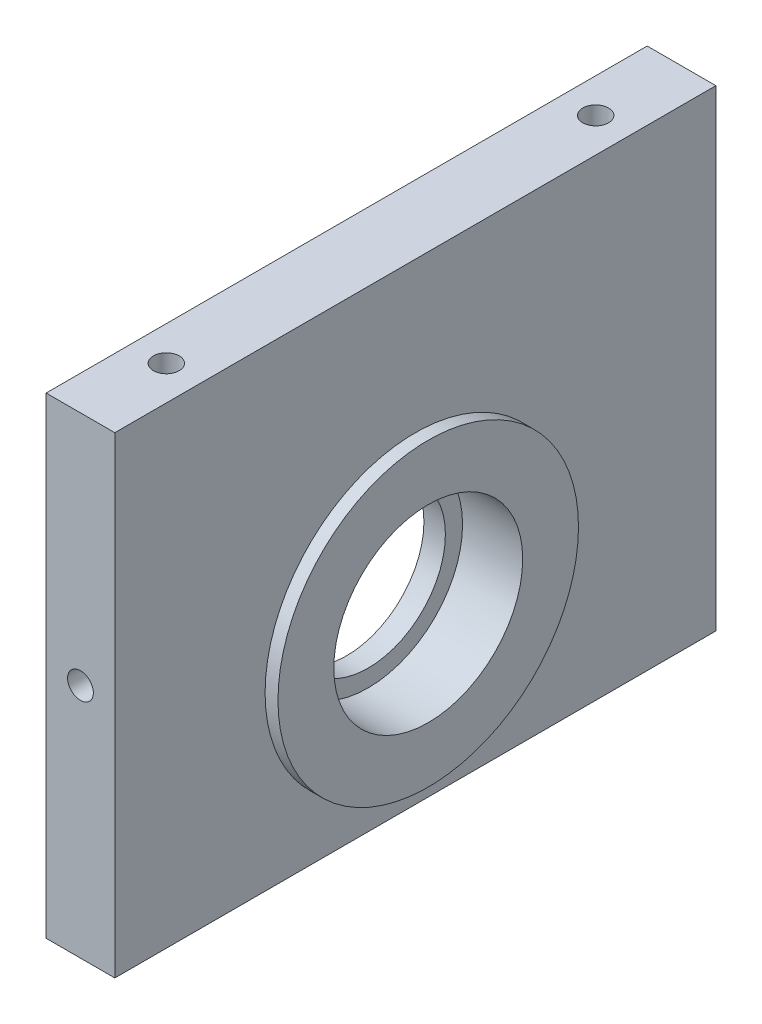
ISO-10303-21;
HEADER;
FILE_DESCRIPTION(('STEP AP214'),'2;1');
FILE_NAME('part.step','',(''),(''),'','','');
FILE_SCHEMA(('AUTOMOTIVE_DESIGN { 1 0 10303 214 1 1 1 1 }'));
ENDSEC;
DATA;
#1=APPLICATION_CONTEXT('core data for automotive mechanical design processes');
#2=APPLICATION_PROTOCOL_DEFINITION('international standard','automotive_design',2000,#1);
#3=PRODUCT_CONTEXT('',#1,'mechanical');
#4=PRODUCT('Part','Part','',(#3));
#5=PRODUCT_RELATED_PRODUCT_CATEGORY('part','',(#4));
#6=PRODUCT_DEFINITION_FORMATION('','',#4);
#7=PRODUCT_DEFINITION_CONTEXT('part definition',#1,'design');
#8=PRODUCT_DEFINITION('design','',#6,#7);
#9=PRODUCT_DEFINITION_SHAPE('','',#8);
#10=(LENGTH_UNIT() NAMED_UNIT(*) SI_UNIT(.MILLI.,.METRE.));
#11=(NAMED_UNIT(*) PLANE_ANGLE_UNIT() SI_UNIT($,.RADIAN.));
#12=(NAMED_UNIT(*) SI_UNIT($,.STERADIAN.) SOLID_ANGLE_UNIT());
#13=UNCERTAINTY_MEASURE_WITH_UNIT(LENGTH_MEASURE(1.E-05),#10,'distance_accuracy_value','');
#14=(GEOMETRIC_REPRESENTATION_CONTEXT(3) GLOBAL_UNCERTAINTY_ASSIGNED_CONTEXT((#13)) GLOBAL_UNIT_ASSIGNED_CONTEXT((#10,
#11,#12)) REPRESENTATION_CONTEXT('',''));
#15=CARTESIAN_POINT('',(0.,0.,0.));
#16=DIRECTION('',(0.,0.,1.));
#17=DIRECTION('',(1.,0.,0.));
#18=AXIS2_PLACEMENT_3D('',#15,#16,#17);
#19=CARTESIAN_POINT('',(4.,0.,0.));
#20=DIRECTION('',(-1.,0.,0.));
#21=DIRECTION('',(0.,0.,1.));
#22=AXIS2_PLACEMENT_3D('',#19,#20,#21);
#23=PLANE('',#22);
#24=DIRECTION('',(0.,1.,0.));
#25=VECTOR('',#24,1.);
#26=CARTESIAN_POINT('',(4.,-20.,-35.));
#27=LINE('',#26,#25);
#28=CARTESIAN_POINT('',(4.,-20.,-35.));
#29=VERTEX_POINT('',#28);
#30=CARTESIAN_POINT('',(4.,35.,-35.));
#31=VERTEX_POINT('',#30);
#32=EDGE_CURVE('E161',#29,#31,#27,.T.);
#33=ORIENTED_EDGE('',*,*,#32,.T.);
#34=DIRECTION('',(0.,0.,1.));
#35=VECTOR('',#34,1.);
#36=CARTESIAN_POINT('',(4.,35.,35.));
#37=LINE('',#36,#35);
#38=CARTESIAN_POINT('',(4.,35.,35.));
#39=VERTEX_POINT('',#38);
#40=EDGE_CURVE('E87',#31,#39,#37,.T.);
#41=ORIENTED_EDGE('',*,*,#40,.T.);
#42=DIRECTION('',(0.,-1.,0.));
#43=VECTOR('',#42,1.);
#44=CARTESIAN_POINT('',(4.,-20.,35.));
#45=LINE('',#44,#43);
#46=CARTESIAN_POINT('',(4.,-20.,35.));
#47=VERTEX_POINT('',#46);
#48=EDGE_CURVE('E164',#39,#47,#45,.T.);
#49=ORIENTED_EDGE('',*,*,#48,.T.);
#50=DIRECTION('',(0.,0.,-1.));
#51=VECTOR('',#50,1.);
#52=CARTESIAN_POINT('',(4.,-20.,35.));
#53=LINE('',#52,#51);
#54=EDGE_CURVE('E55',#47,#29,#53,.T.);
#55=ORIENTED_EDGE('',*,*,#54,.T.);
#56=EDGE_LOOP('',(#33,#41,#49,#55));
#57=FACE_BOUND('',#56,.T.);
#58=CARTESIAN_POINT('',(4.,0.,0.));
#59=DIRECTION('',(-1.,0.,0.));
#60=DIRECTION('',(0.,0.,1.));
#61=AXIS2_PLACEMENT_3D('',#58,#59,#60);
#62=CIRCLE('',#61,17.5);
#63=CARTESIAN_POINT('',(4.,0.,17.5));
#64=VERTEX_POINT('',#63);
#65=EDGE_CURVE('E11',#64,#64,#62,.F.);
#66=ORIENTED_EDGE('',*,*,#65,.F.);
#67=EDGE_LOOP('',(#66));
#68=FACE_BOUND('',#67,.T.);
#69=ADVANCED_FACE('F38',(#57,#68),#23,.F.);
#70=CARTESIAN_POINT('',(4.,0.,0.));
#71=DIRECTION('',(-1.,0.,0.));
#72=DIRECTION('',(0.,0.,1.));
#73=AXIS2_PLACEMENT_3D('',#70,#71,#72);
#74=CYLINDRICAL_SURFACE('',#73,9.);
#75=CARTESIAN_POINT('',(-4.,0.,0.));
#76=DIRECTION('',(1.,0.,0.));
#77=DIRECTION('',(0.,0.,-1.));
#78=AXIS2_PLACEMENT_3D('',#75,#76,#77);
#79=CIRCLE('',#78,9.);
#80=CARTESIAN_POINT('',(-4.,0.,-9.));
#81=VERTEX_POINT('',#80);
#82=EDGE_CURVE('E157',#81,#81,#79,.T.);
#83=ORIENTED_EDGE('',*,*,#82,.F.);
#84=EDGE_LOOP('',(#83));
#85=FACE_BOUND('',#84,.T.);
#86=CARTESIAN_POINT('',(-1.5,0.,0.));
#87=DIRECTION('',(1.,0.,0.));
#88=DIRECTION('',(0.,0.,-1.));
#89=AXIS2_PLACEMENT_3D('',#86,#87,#88);
#90=CIRCLE('',#89,9.);
#91=CARTESIAN_POINT('',(-1.5,0.,-9.));
#92=VERTEX_POINT('',#91);
#93=EDGE_CURVE('E156',#92,#92,#90,.T.);
#94=ORIENTED_EDGE('',*,*,#93,.T.);
#95=EDGE_LOOP('',(#94));
#96=FACE_BOUND('',#95,.T.);
#97=ADVANCED_FACE('F182',(#85,#96),#74,.F.);
#98=CARTESIAN_POINT('',(-4.,0.,0.));
#99=DIRECTION('',(-1.,0.,0.));
#100=DIRECTION('',(0.,0.,1.));
#101=AXIS2_PLACEMENT_3D('',#98,#99,#100);
#102=PLANE('',#101);
#103=DIRECTION('',(0.,1.,0.));
#104=VECTOR('',#103,1.);
#105=CARTESIAN_POINT('',(-4.,-20.,-35.));
#106=LINE('',#105,#104);
#107=CARTESIAN_POINT('',(-4.,-20.,-35.));
#108=VERTEX_POINT('',#107);
#109=CARTESIAN_POINT('',(-4.,35.,-35.));
#110=VERTEX_POINT('',#109);
#111=EDGE_CURVE('E160',#108,#110,#106,.T.);
#112=ORIENTED_EDGE('',*,*,#111,.F.);
#113=DIRECTION('',(0.,0.,-1.));
#114=VECTOR('',#113,1.);
#115=CARTESIAN_POINT('',(-4.,-20.,35.));
#116=LINE('',#115,#114);
#117=CARTESIAN_POINT('',(-4.,-20.,35.));
#118=VERTEX_POINT('',#117);
#119=EDGE_CURVE('E79',#118,#108,#116,.T.);
#120=ORIENTED_EDGE('',*,*,#119,.F.);
#121=DIRECTION('',(0.,-1.,0.));
#122=VECTOR('',#121,1.);
#123=CARTESIAN_POINT('',(-4.,-20.,35.));
#124=LINE('',#123,#122);
#125=CARTESIAN_POINT('',(-4.,35.,35.));
#126=VERTEX_POINT('',#125);
#127=EDGE_CURVE('E73',#126,#118,#124,.T.);
#128=ORIENTED_EDGE('',*,*,#127,.F.);
#129=DIRECTION('',(0.,0.,1.));
#130=VECTOR('',#129,1.);
#131=CARTESIAN_POINT('',(-4.,35.,35.));
#132=LINE('',#131,#130);
#133=EDGE_CURVE('E170',#110,#126,#132,.T.);
#134=ORIENTED_EDGE('',*,*,#133,.F.);
#135=EDGE_LOOP('',(#112,#120,#128,#134));
#136=FACE_BOUND('',#135,.T.);
#137=ORIENTED_EDGE('',*,*,#82,.T.);
#138=EDGE_LOOP('',(#137));
#139=FACE_BOUND('',#138,.T.);
#140=ADVANCED_FACE('F217',(#136,#139),#102,.T.);
#141=CARTESIAN_POINT('',(4.,-20.,-35.));
#142=DIRECTION('',(0.,0.,1.));
#143=DIRECTION('',(1.,0.,0.));
#144=AXIS2_PLACEMENT_3D('',#141,#142,#143);
#145=PLANE('',#144);
#146=CARTESIAN_POINT('',(0.,7.5,-35.));
#147=DIRECTION('',(0.,0.,-1.));
#148=DIRECTION('',(-1.,0.,0.));
#149=AXIS2_PLACEMENT_3D('',#146,#147,#148);
#150=CIRCLE('',#149,1.5);
#151=CARTESIAN_POINT('',(-1.5,7.5,-35.));
#152=VERTEX_POINT('',#151);
#153=EDGE_CURVE('E117',#152,#152,#150,.T.);
#154=ORIENTED_EDGE('',*,*,#153,.F.);
#155=EDGE_LOOP('',(#154));
#156=FACE_BOUND('',#155,.T.);
#157=ORIENTED_EDGE('',*,*,#111,.T.);
#158=DIRECTION('',(-1.,0.,0.));
#159=VECTOR('',#158,1.);
#160=CARTESIAN_POINT('',(4.,35.,-35.));
#161=LINE('',#160,#159);
#162=EDGE_CURVE('E47',#31,#110,#161,.T.);
#163=ORIENTED_EDGE('',*,*,#162,.F.);
#164=ORIENTED_EDGE('',*,*,#32,.F.);
#165=DIRECTION('',(-1.,0.,0.));
#166=VECTOR('',#165,1.);
#167=CARTESIAN_POINT('',(4.,-20.,-35.));
#168=LINE('',#167,#166);
#169=EDGE_CURVE('E167',#29,#108,#168,.T.);
#170=ORIENTED_EDGE('',*,*,#169,.T.);
#171=EDGE_LOOP('',(#157,#163,#164,#170));
#172=FACE_BOUND('',#171,.T.);
#173=ADVANCED_FACE('F40',(#156,#172),#145,.F.);
#174=CARTESIAN_POINT('',(4.,35.,35.));
#175=DIRECTION('',(0.,-1.,0.));
#176=DIRECTION('',(0.,0.,-1.));
#177=AXIS2_PLACEMENT_3D('',#174,#175,#176);
#178=PLANE('',#177);
#179=CARTESIAN_POINT('',(0.,35.,25.));
#180=DIRECTION('',(0.,1.,0.));
#181=DIRECTION('',(0.,0.,1.));
#182=AXIS2_PLACEMENT_3D('',#179,#180,#181);
#183=CIRCLE('',#182,1.5);
#184=CARTESIAN_POINT('',(0.,35.,26.5));
#185=VERTEX_POINT('',#184);
#186=EDGE_CURVE('E129',#185,#185,#183,.T.);
#187=ORIENTED_EDGE('',*,*,#186,.F.);
#188=EDGE_LOOP('',(#187));
#189=FACE_BOUND('',#188,.T.);
#190=CARTESIAN_POINT('',(0.,35.,-25.));
#191=DIRECTION('',(0.,1.,0.));
#192=DIRECTION('',(0.,0.,1.));
#193=AXIS2_PLACEMENT_3D('',#190,#191,#192);
#194=CIRCLE('',#193,1.5);
#195=CARTESIAN_POINT('',(0.,35.,-23.5));
#196=VERTEX_POINT('',#195);
#197=EDGE_CURVE('E135',#196,#196,#194,.T.);
#198=ORIENTED_EDGE('',*,*,#197,.F.);
#199=EDGE_LOOP('',(#198));
#200=FACE_BOUND('',#199,.T.);
#201=ORIENTED_EDGE('',*,*,#133,.T.);
#202=DIRECTION('',(-1.,0.,0.));
#203=VECTOR('',#202,1.);
#204=CARTESIAN_POINT('',(4.,35.,35.));
#205=LINE('',#204,#203);
#206=EDGE_CURVE('E177',#39,#126,#205,.T.);
#207=ORIENTED_EDGE('',*,*,#206,.F.);
#208=ORIENTED_EDGE('',*,*,#40,.F.);
#209=ORIENTED_EDGE('',*,*,#162,.T.);
#210=EDGE_LOOP('',(#201,#207,#208,#209));
#211=FACE_BOUND('',#210,.T.);
#212=ADVANCED_FACE('F229',(#189,#200,#211),#178,.F.);
#213=CARTESIAN_POINT('',(4.,-20.,35.));
#214=DIRECTION('',(0.,0.,-1.));
#215=DIRECTION('',(-1.,0.,0.));
#216=AXIS2_PLACEMENT_3D('',#213,#214,#215);
#217=PLANE('',#216);
#218=CARTESIAN_POINT('',(0.,7.5,35.));
#219=DIRECTION('',(0.,0.,1.));
#220=DIRECTION('',(1.,0.,0.));
#221=AXIS2_PLACEMENT_3D('',#218,#219,#220);
#222=CIRCLE('',#221,1.5);
#223=CARTESIAN_POINT('',(1.5,7.5,35.));
#224=VERTEX_POINT('',#223);
#225=EDGE_CURVE('E116',#224,#224,#222,.T.);
#226=ORIENTED_EDGE('',*,*,#225,.F.);
#227=EDGE_LOOP('',(#226));
#228=FACE_BOUND('',#227,.T.);
#229=ORIENTED_EDGE('',*,*,#127,.T.);
#230=DIRECTION('',(-1.,0.,0.));
#231=VECTOR('',#230,1.);
#232=CARTESIAN_POINT('',(4.,-20.,35.));
#233=LINE('',#232,#231);
#234=EDGE_CURVE('E175',#47,#118,#233,.T.);
#235=ORIENTED_EDGE('',*,*,#234,.F.);
#236=ORIENTED_EDGE('',*,*,#48,.F.);
#237=ORIENTED_EDGE('',*,*,#206,.T.);
#238=EDGE_LOOP('',(#229,#235,#236,#237));
#239=FACE_BOUND('',#238,.T.);
#240=ADVANCED_FACE('F226',(#228,#239),#217,.F.);
#241=CARTESIAN_POINT('',(4.,-20.,35.));
#242=DIRECTION('',(0.,1.,0.));
#243=DIRECTION('',(0.,0.,1.));
#244=AXIS2_PLACEMENT_3D('',#241,#242,#243);
#245=PLANE('',#244);
#246=CARTESIAN_POINT('',(0.,-20.,25.));
#247=DIRECTION('',(0.,-1.,0.));
#248=DIRECTION('',(0.,0.,-1.));
#249=AXIS2_PLACEMENT_3D('',#246,#247,#248);
#250=CIRCLE('',#249,1.5);
#251=CARTESIAN_POINT('',(0.,-20.,23.5));
#252=VERTEX_POINT('',#251);
#253=EDGE_CURVE('E141',#252,#252,#250,.T.);
#254=ORIENTED_EDGE('',*,*,#253,.F.);
#255=EDGE_LOOP('',(#254));
#256=FACE_BOUND('',#255,.T.);
#257=CARTESIAN_POINT('',(0.,-20.,-25.));
#258=DIRECTION('',(0.,-1.,0.));
#259=DIRECTION('',(0.,0.,-1.));
#260=AXIS2_PLACEMENT_3D('',#257,#258,#259);
#261=CIRCLE('',#260,1.5);
#262=CARTESIAN_POINT('',(0.,-20.,-26.5));
#263=VERTEX_POINT('',#262);
#264=EDGE_CURVE('E147',#263,#263,#261,.T.);
#265=ORIENTED_EDGE('',*,*,#264,.F.);
#266=EDGE_LOOP('',(#265));
#267=FACE_BOUND('',#266,.T.);
#268=ORIENTED_EDGE('',*,*,#119,.T.);
#269=ORIENTED_EDGE('',*,*,#169,.F.);
#270=ORIENTED_EDGE('',*,*,#54,.F.);
#271=ORIENTED_EDGE('',*,*,#234,.T.);
#272=EDGE_LOOP('',(#268,#269,#270,#271));
#273=FACE_BOUND('',#272,.T.);
#274=ADVANCED_FACE('F194',(#256,#267,#273),#245,.F.);
#275=CARTESIAN_POINT('',(-1.5,0.,0.));
#276=DIRECTION('',(1.,0.,0.));
#277=DIRECTION('',(0.,0.,-1.));
#278=AXIS2_PLACEMENT_3D('',#275,#276,#277);
#279=CYLINDRICAL_SURFACE('',#278,11.);
#280=CARTESIAN_POINT('',(-1.5,0.,0.));
#281=DIRECTION('',(1.,0.,0.));
#282=DIRECTION('',(0.,0.,-1.));
#283=AXIS2_PLACEMENT_3D('',#280,#281,#282);
#284=CIRCLE('',#283,11.);
#285=CARTESIAN_POINT('',(-1.5,0.,-11.));
#286=VERTEX_POINT('',#285);
#287=EDGE_CURVE('E153',#286,#286,#284,.T.);
#288=ORIENTED_EDGE('',*,*,#287,.F.);
#289=EDGE_LOOP('',(#288));
#290=FACE_BOUND('',#289,.T.);
#291=CARTESIAN_POINT('',(5.5,0.,0.));
#292=DIRECTION('',(1.,0.,0.));
#293=DIRECTION('',(0.,0.,-1.));
#294=AXIS2_PLACEMENT_3D('',#291,#292,#293);
#295=CIRCLE('',#294,11.);
#296=CARTESIAN_POINT('',(5.5,0.,-11.));
#297=VERTEX_POINT('',#296);
#298=EDGE_CURVE('E198',#297,#297,#295,.T.);
#299=ORIENTED_EDGE('',*,*,#298,.T.);
#300=EDGE_LOOP('',(#299));
#301=FACE_BOUND('',#300,.T.);
#302=ADVANCED_FACE('F188',(#290,#301),#279,.F.);
#303=CARTESIAN_POINT('',(-1.5,0.,0.));
#304=DIRECTION('',(1.,0.,0.));
#305=DIRECTION('',(0.,0.,-1.));
#306=AXIS2_PLACEMENT_3D('',#303,#304,#305);
#307=PLANE('',#306);
#308=ORIENTED_EDGE('',*,*,#93,.F.);
#309=EDGE_LOOP('',(#308));
#310=FACE_BOUND('',#309,.T.);
#311=ORIENTED_EDGE('',*,*,#287,.T.);
#312=EDGE_LOOP('',(#311));
#313=FACE_BOUND('',#312,.T.);
#314=ADVANCED_FACE('F184',(#310,#313),#307,.T.);
#315=CARTESIAN_POINT('',(0.,-5.,-25.));
#316=DIRECTION('',(0.,-1.,0.));
#317=DIRECTION('',(0.,0.,-1.));
#318=AXIS2_PLACEMENT_3D('',#315,#316,#317);
#319=CONICAL_SURFACE('',#318,1.5,1.02974425867665);
#320=CARTESIAN_POINT('',(0.,-4.09870907145866,-25.));
#321=VERTEX_POINT('',#320);
#322=VERTEX_LOOP('',#321);
#323=FACE_BOUND('',#322,.T.);
#324=CARTESIAN_POINT('',(0.,-5.,-25.));
#325=DIRECTION('',(0.,-1.,0.));
#326=DIRECTION('',(0.,0.,-1.));
#327=AXIS2_PLACEMENT_3D('',#324,#325,#326);
#328=CIRCLE('',#327,1.5);
#329=CARTESIAN_POINT('',(0.,-5.,-26.5));
#330=VERTEX_POINT('',#329);
#331=EDGE_CURVE('E150',#330,#330,#328,.T.);
#332=ORIENTED_EDGE('',*,*,#331,.T.);
#333=EDGE_LOOP('',(#332));
#334=FACE_BOUND('',#333,.T.);
#335=ADVANCED_FACE('F187',(#323,#334),#319,.F.);
#336=CARTESIAN_POINT('',(0.,-20.,-25.));
#337=DIRECTION('',(0.,-1.,0.));
#338=DIRECTION('',(0.,0.,-1.));
#339=AXIS2_PLACEMENT_3D('',#336,#337,#338);
#340=CYLINDRICAL_SURFACE('',#339,1.5);
#341=ORIENTED_EDGE('',*,*,#331,.F.);
#342=EDGE_LOOP('',(#341));
#343=FACE_BOUND('',#342,.T.);
#344=ORIENTED_EDGE('',*,*,#264,.T.);
#345=EDGE_LOOP('',(#344));
#346=FACE_BOUND('',#345,.T.);
#347=ADVANCED_FACE('F273',(#343,#346),#340,.F.);
#348=CARTESIAN_POINT('',(0.,-5.,25.));
#349=DIRECTION('',(0.,-1.,0.));
#350=DIRECTION('',(0.,0.,-1.));
#351=AXIS2_PLACEMENT_3D('',#348,#349,#350);
#352=CONICAL_SURFACE('',#351,1.5,1.02974425867665);
#353=CARTESIAN_POINT('',(0.,-4.09870907145866,25.));
#354=VERTEX_POINT('',#353);
#355=VERTEX_LOOP('',#354);
#356=FACE_BOUND('',#355,.T.);
#357=CARTESIAN_POINT('',(0.,-5.,25.));
#358=DIRECTION('',(0.,-1.,0.));
#359=DIRECTION('',(0.,0.,-1.));
#360=AXIS2_PLACEMENT_3D('',#357,#358,#359);
#361=CIRCLE('',#360,1.5);
#362=CARTESIAN_POINT('',(0.,-5.,23.5));
#363=VERTEX_POINT('',#362);
#364=EDGE_CURVE('E144',#363,#363,#361,.T.);
#365=ORIENTED_EDGE('',*,*,#364,.T.);
#366=EDGE_LOOP('',(#365));
#367=FACE_BOUND('',#366,.T.);
#368=ADVANCED_FACE('F269',(#356,#367),#352,.F.);
#369=CARTESIAN_POINT('',(0.,-20.,25.));
#370=DIRECTION('',(0.,-1.,0.));
#371=DIRECTION('',(0.,0.,-1.));
#372=AXIS2_PLACEMENT_3D('',#369,#370,#371);
#373=CYLINDRICAL_SURFACE('',#372,1.5);
#374=ORIENTED_EDGE('',*,*,#364,.F.);
#375=EDGE_LOOP('',(#374));
#376=FACE_BOUND('',#375,.T.);
#377=ORIENTED_EDGE('',*,*,#253,.T.);
#378=EDGE_LOOP('',(#377));
#379=FACE_BOUND('',#378,.T.);
#380=ADVANCED_FACE('F261',(#376,#379),#373,.F.);
#381=CARTESIAN_POINT('',(0.,20.,-25.));
#382=DIRECTION('',(0.,1.,0.));
#383=DIRECTION('',(0.,0.,1.));
#384=AXIS2_PLACEMENT_3D('',#381,#382,#383);
#385=CONICAL_SURFACE('',#384,1.5,1.02974425867665);
#386=CARTESIAN_POINT('',(0.,19.0987090714587,-25.));
#387=VERTEX_POINT('',#386);
#388=VERTEX_LOOP('',#387);
#389=FACE_BOUND('',#388,.T.);
#390=CARTESIAN_POINT('',(0.,20.,-25.));
#391=DIRECTION('',(0.,1.,0.));
#392=DIRECTION('',(0.,0.,1.));
#393=AXIS2_PLACEMENT_3D('',#390,#391,#392);
#394=CIRCLE('',#393,1.5);
#395=CARTESIAN_POINT('',(0.,20.,-23.5));
#396=VERTEX_POINT('',#395);
#397=EDGE_CURVE('E138',#396,#396,#394,.T.);
#398=ORIENTED_EDGE('',*,*,#397,.T.);
#399=EDGE_LOOP('',(#398));
#400=FACE_BOUND('',#399,.T.);
#401=ADVANCED_FACE('F251',(#389,#400),#385,.F.);
#402=CARTESIAN_POINT('',(0.,35.,-25.));
#403=DIRECTION('',(0.,1.,0.));
#404=DIRECTION('',(0.,0.,1.));
#405=AXIS2_PLACEMENT_3D('',#402,#403,#404);
#406=CYLINDRICAL_SURFACE('',#405,1.5);
#407=ORIENTED_EDGE('',*,*,#397,.F.);
#408=EDGE_LOOP('',(#407));
#409=FACE_BOUND('',#408,.T.);
#410=ORIENTED_EDGE('',*,*,#197,.T.);
#411=EDGE_LOOP('',(#410));
#412=FACE_BOUND('',#411,.T.);
#413=ADVANCED_FACE('F248',(#409,#412),#406,.F.);
#414=CARTESIAN_POINT('',(0.,20.,25.));
#415=DIRECTION('',(0.,1.,0.));
#416=DIRECTION('',(0.,0.,1.));
#417=AXIS2_PLACEMENT_3D('',#414,#415,#416);
#418=CONICAL_SURFACE('',#417,1.5,1.02974425867665);
#419=CARTESIAN_POINT('',(0.,19.0987090714587,25.));
#420=VERTEX_POINT('',#419);
#421=VERTEX_LOOP('',#420);
#422=FACE_BOUND('',#421,.T.);
#423=CARTESIAN_POINT('',(0.,20.,25.));
#424=DIRECTION('',(0.,1.,0.));
#425=DIRECTION('',(0.,0.,1.));
#426=AXIS2_PLACEMENT_3D('',#423,#424,#425);
#427=CIRCLE('',#426,1.5);
#428=CARTESIAN_POINT('',(0.,20.,26.5));
#429=VERTEX_POINT('',#428);
#430=EDGE_CURVE('E132',#429,#429,#427,.T.);
#431=ORIENTED_EDGE('',*,*,#430,.T.);
#432=EDGE_LOOP('',(#431));
#433=FACE_BOUND('',#432,.T.);
#434=ADVANCED_FACE('F250',(#422,#433),#418,.F.);
#435=CARTESIAN_POINT('',(0.,35.,25.));
#436=DIRECTION('',(0.,1.,0.));
#437=DIRECTION('',(0.,0.,1.));
#438=AXIS2_PLACEMENT_3D('',#435,#436,#437);
#439=CYLINDRICAL_SURFACE('',#438,1.5);
#440=ORIENTED_EDGE('',*,*,#430,.F.);
#441=EDGE_LOOP('',(#440));
#442=FACE_BOUND('',#441,.T.);
#443=ORIENTED_EDGE('',*,*,#186,.T.);
#444=EDGE_LOOP('',(#443));
#445=FACE_BOUND('',#444,.T.);
#446=ADVANCED_FACE('F258',(#442,#445),#439,.F.);
#447=CARTESIAN_POINT('',(0.,7.5,20.));
#448=DIRECTION('',(0.,0.,1.));
#449=DIRECTION('',(1.,0.,0.));
#450=AXIS2_PLACEMENT_3D('',#447,#448,#449);
#451=CONICAL_SURFACE('',#450,1.5,1.02974425867665);
#452=CARTESIAN_POINT('',(0.,7.5,19.0987090714587));
#453=VERTEX_POINT('',#452);
#454=VERTEX_LOOP('',#453);
#455=FACE_BOUND('',#454,.T.);
#456=CARTESIAN_POINT('',(0.,7.5,20.));
#457=DIRECTION('',(0.,0.,1.));
#458=DIRECTION('',(1.,0.,0.));
#459=AXIS2_PLACEMENT_3D('',#456,#457,#458);
#460=CIRCLE('',#459,1.5);
#461=CARTESIAN_POINT('',(1.5,7.5,20.));
#462=VERTEX_POINT('',#461);
#463=EDGE_CURVE('E120',#462,#462,#460,.T.);
#464=ORIENTED_EDGE('',*,*,#463,.T.);
#465=EDGE_LOOP('',(#464));
#466=FACE_BOUND('',#465,.T.);
#467=ADVANCED_FACE('F335',(#455,#466),#451,.F.);
#468=CARTESIAN_POINT('',(0.,7.5,35.));
#469=DIRECTION('',(0.,0.,1.));
#470=DIRECTION('',(1.,0.,0.));
#471=AXIS2_PLACEMENT_3D('',#468,#469,#470);
#472=CYLINDRICAL_SURFACE('',#471,1.5);
#473=ORIENTED_EDGE('',*,*,#463,.F.);
#474=EDGE_LOOP('',(#473));
#475=FACE_BOUND('',#474,.T.);
#476=ORIENTED_EDGE('',*,*,#225,.T.);
#477=EDGE_LOOP('',(#476));
#478=FACE_BOUND('',#477,.T.);
#479=ADVANCED_FACE('F110',(#475,#478),#472,.F.);
#480=CARTESIAN_POINT('',(0.,7.5,-20.));
#481=DIRECTION('',(0.,0.,-1.));
#482=DIRECTION('',(-1.,0.,0.));
#483=AXIS2_PLACEMENT_3D('',#480,#481,#482);
#484=CONICAL_SURFACE('',#483,1.5,1.02974425867665);
#485=CARTESIAN_POINT('',(0.,7.5,-19.0987090714587));
#486=VERTEX_POINT('',#485);
#487=VERTEX_LOOP('',#486);
#488=FACE_BOUND('',#487,.T.);
#489=CARTESIAN_POINT('',(0.,7.5,-20.));
#490=DIRECTION('',(0.,0.,-1.));
#491=DIRECTION('',(-1.,0.,0.));
#492=AXIS2_PLACEMENT_3D('',#489,#490,#491);
#493=CIRCLE('',#492,1.5);
#494=CARTESIAN_POINT('',(-1.49999999999999,7.5,-20.));
#495=VERTEX_POINT('',#494);
#496=EDGE_CURVE('E114',#495,#495,#493,.T.);
#497=ORIENTED_EDGE('',*,*,#496,.T.);
#498=EDGE_LOOP('',(#497));
#499=FACE_BOUND('',#498,.T.);
#500=ADVANCED_FACE('F106',(#488,#499),#484,.F.);
#501=CARTESIAN_POINT('',(0.,7.5,-35.));
#502=DIRECTION('',(0.,0.,-1.));
#503=DIRECTION('',(-1.,0.,0.));
#504=AXIS2_PLACEMENT_3D('',#501,#502,#503);
#505=CYLINDRICAL_SURFACE('',#504,1.5);
#506=ORIENTED_EDGE('',*,*,#496,.F.);
#507=EDGE_LOOP('',(#506));
#508=FACE_BOUND('',#507,.T.);
#509=ORIENTED_EDGE('',*,*,#153,.T.);
#510=EDGE_LOOP('',(#509));
#511=FACE_BOUND('',#510,.T.);
#512=ADVANCED_FACE('F109',(#508,#511),#505,.F.);
#513=CARTESIAN_POINT('',(5.5,0.,0.));
#514=DIRECTION('',(-1.,0.,0.));
#515=DIRECTION('',(0.,0.,1.));
#516=AXIS2_PLACEMENT_3D('',#513,#514,#515);
#517=CYLINDRICAL_SURFACE('',#516,17.5);
#518=CARTESIAN_POINT('',(5.5,0.,0.));
#519=DIRECTION('',(1.,0.,0.));
#520=DIRECTION('',(0.,0.,-1.));
#521=AXIS2_PLACEMENT_3D('',#518,#519,#520);
#522=CIRCLE('',#521,17.5);
#523=CARTESIAN_POINT('',(5.5,0.,-17.5));
#524=VERTEX_POINT('',#523);
#525=EDGE_CURVE('E123',#524,#524,#522,.T.);
#526=ORIENTED_EDGE('',*,*,#525,.F.);
#527=EDGE_LOOP('',(#526));
#528=FACE_BOUND('',#527,.T.);
#529=ORIENTED_EDGE('',*,*,#65,.T.);
#530=EDGE_LOOP('',(#529));
#531=FACE_BOUND('',#530,.T.);
#532=ADVANCED_FACE('F206',(#528,#531),#517,.T.);
#533=CARTESIAN_POINT('',(5.5,0.,0.));
#534=DIRECTION('',(1.,0.,0.));
#535=DIRECTION('',(0.,0.,-1.));
#536=AXIS2_PLACEMENT_3D('',#533,#534,#535);
#537=PLANE('',#536);
#538=ORIENTED_EDGE('',*,*,#525,.T.);
#539=EDGE_LOOP('',(#538));
#540=FACE_BOUND('',#539,.T.);
#541=ORIENTED_EDGE('',*,*,#298,.F.);
#542=EDGE_LOOP('',(#541));
#543=FACE_BOUND('',#542,.T.);
#544=ADVANCED_FACE('F204',(#540,#543),#537,.T.);
#545=CLOSED_SHELL('',(#69,#97,#140,#173,#212,#240,#274,#302,#314,#335,#347,#368,#380,#401,#413,
#434,#446,#467,#479,#500,#512,#532,#544));
#546=MANIFOLD_SOLID_BREP('B2',#545);
#547=ADVANCED_BREP_SHAPE_REPRESENTATION('',(#18,#546),#14);
#548=SHAPE_DEFINITION_REPRESENTATION(#9,#547);
ENDSEC;
END-ISO-10303-21;
